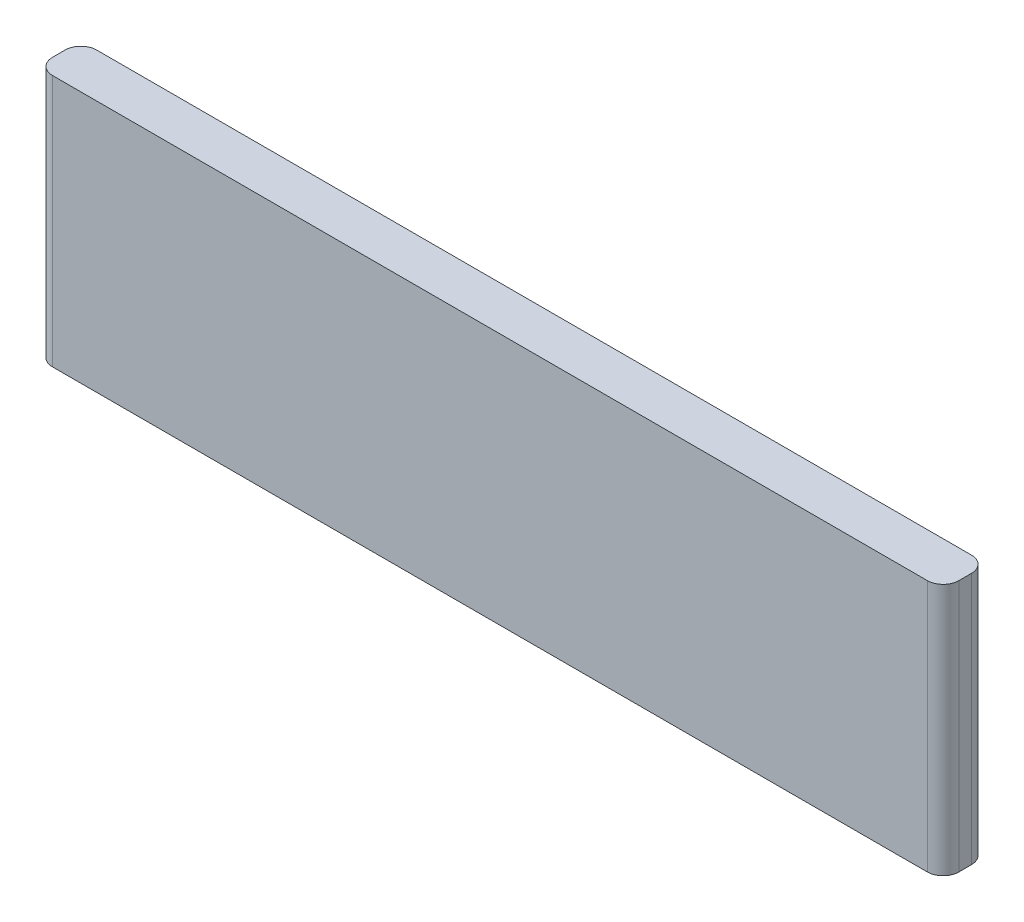
ISO-10303-21;
HEADER;
FILE_DESCRIPTION(('STEP AP214'),'2;1');
FILE_NAME('part.step','',(''),(''),'','','');
FILE_SCHEMA(('AUTOMOTIVE_DESIGN { 1 0 10303 214 1 1 1 1 }'));
ENDSEC;
DATA;
#1=APPLICATION_CONTEXT('core data for automotive mechanical design processes');
#2=APPLICATION_PROTOCOL_DEFINITION('international standard','automotive_design',2000,#1);
#3=PRODUCT_CONTEXT('',#1,'mechanical');
#4=PRODUCT('Part','Part','',(#3));
#5=PRODUCT_RELATED_PRODUCT_CATEGORY('part','',(#4));
#6=PRODUCT_DEFINITION_FORMATION('','',#4);
#7=PRODUCT_DEFINITION_CONTEXT('part definition',#1,'design');
#8=PRODUCT_DEFINITION('design','',#6,#7);
#9=PRODUCT_DEFINITION_SHAPE('','',#8);
#10=(LENGTH_UNIT() NAMED_UNIT(*) SI_UNIT(.MILLI.,.METRE.));
#11=(NAMED_UNIT(*) PLANE_ANGLE_UNIT() SI_UNIT($,.RADIAN.));
#12=(NAMED_UNIT(*) SI_UNIT($,.STERADIAN.) SOLID_ANGLE_UNIT());
#13=UNCERTAINTY_MEASURE_WITH_UNIT(LENGTH_MEASURE(1.E-05),#10,'distance_accuracy_value','');
#14=(GEOMETRIC_REPRESENTATION_CONTEXT(3) GLOBAL_UNCERTAINTY_ASSIGNED_CONTEXT((#13)) GLOBAL_UNIT_ASSIGNED_CONTEXT((#10,
#11,#12)) REPRESENTATION_CONTEXT('',''));
#15=CARTESIAN_POINT('',(0.,0.,0.));
#16=DIRECTION('',(0.,0.,1.));
#17=DIRECTION('',(1.,0.,0.));
#18=AXIS2_PLACEMENT_3D('',#15,#16,#17);
#19=CARTESIAN_POINT('',(21.55,12.,1.05));
#20=DIRECTION('',(-1.,0.,0.));
#21=DIRECTION('',(0.,0.,1.));
#22=AXIS2_PLACEMENT_3D('',#19,#20,#21);
#23=PLANE('',#22);
#24=DIRECTION('',(0.,0.,-1.));
#25=VECTOR('',#24,1.);
#26=CARTESIAN_POINT('',(21.55,0.,1.05));
#27=LINE('',#26,#25);
#28=CARTESIAN_POINT('',(21.55,0.,0.3));
#29=VERTEX_POINT('',#28);
#30=CARTESIAN_POINT('',(21.55,0.,-0.3));
#31=VERTEX_POINT('',#30);
#32=EDGE_CURVE('E188',#29,#31,#27,.T.);
#33=ORIENTED_EDGE('',*,*,#32,.T.);
#34=DIRECTION('',(0.,-1.,0.));
#35=VECTOR('',#34,1.);
#36=CARTESIAN_POINT('',(21.55,12.,-0.3));
#37=LINE('',#36,#35);
#38=CARTESIAN_POINT('',(21.55,12.,-0.3));
#39=VERTEX_POINT('',#38);
#40=EDGE_CURVE('E11',#31,#39,#37,.F.);
#41=ORIENTED_EDGE('',*,*,#40,.T.);
#42=DIRECTION('',(0.,0.,-1.));
#43=VECTOR('',#42,1.);
#44=CARTESIAN_POINT('',(21.55,12.,1.05));
#45=LINE('',#44,#43);
#46=CARTESIAN_POINT('',(21.55,12.,0.3));
#47=VERTEX_POINT('',#46);
#48=EDGE_CURVE('E141',#47,#39,#45,.T.);
#49=ORIENTED_EDGE('',*,*,#48,.F.);
#50=DIRECTION('',(0.,-1.,0.));
#51=VECTOR('',#50,1.);
#52=CARTESIAN_POINT('',(21.55,12.,0.3));
#53=LINE('',#52,#51);
#54=EDGE_CURVE('E54',#47,#29,#53,.T.);
#55=ORIENTED_EDGE('',*,*,#54,.T.);
#56=EDGE_LOOP('',(#33,#41,#49,#55));
#57=FACE_BOUND('',#56,.T.);
#58=ADVANCED_FACE('F45',(#57),#23,.F.);
#59=CARTESIAN_POINT('',(-21.55,12.,-1.05));
#60=DIRECTION('',(0.,0.,1.));
#61=DIRECTION('',(1.,0.,0.));
#62=AXIS2_PLACEMENT_3D('',#59,#60,#61);
#63=PLANE('',#62);
#64=DIRECTION('',(-1.,0.,0.));
#65=VECTOR('',#64,1.);
#66=CARTESIAN_POINT('',(-21.55,0.,-1.05));
#67=LINE('',#66,#65);
#68=CARTESIAN_POINT('',(20.8,0.,-1.05));
#69=VERTEX_POINT('',#68);
#70=CARTESIAN_POINT('',(-20.8,0.,-1.05));
#71=VERTEX_POINT('',#70);
#72=EDGE_CURVE('E148',#69,#71,#67,.T.);
#73=ORIENTED_EDGE('',*,*,#72,.T.);
#74=DIRECTION('',(0.,-1.,0.));
#75=VECTOR('',#74,1.);
#76=CARTESIAN_POINT('',(-20.8,12.,-1.05));
#77=LINE('',#76,#75);
#78=CARTESIAN_POINT('',(-20.8,12.,-1.05));
#79=VERTEX_POINT('',#78);
#80=EDGE_CURVE('E61',#71,#79,#77,.F.);
#81=ORIENTED_EDGE('',*,*,#80,.T.);
#82=DIRECTION('',(-1.,0.,0.));
#83=VECTOR('',#82,1.);
#84=CARTESIAN_POINT('',(-21.55,12.,-1.05));
#85=LINE('',#84,#83);
#86=CARTESIAN_POINT('',(20.8,12.,-1.05));
#87=VERTEX_POINT('',#86);
#88=EDGE_CURVE('E146',#87,#79,#85,.T.);
#89=ORIENTED_EDGE('',*,*,#88,.F.);
#90=DIRECTION('',(0.,-1.,0.));
#91=VECTOR('',#90,1.);
#92=CARTESIAN_POINT('',(20.8,12.,-1.05));
#93=LINE('',#92,#91);
#94=EDGE_CURVE('E177',#87,#69,#93,.T.);
#95=ORIENTED_EDGE('',*,*,#94,.T.);
#96=EDGE_LOOP('',(#73,#81,#89,#95));
#97=FACE_BOUND('',#96,.T.);
#98=ADVANCED_FACE('F213',(#97),#63,.F.);
#99=CARTESIAN_POINT('',(-21.55,12.,1.05));
#100=DIRECTION('',(1.,0.,0.));
#101=DIRECTION('',(0.,0.,-1.));
#102=AXIS2_PLACEMENT_3D('',#99,#100,#101);
#103=PLANE('',#102);
#104=DIRECTION('',(0.,0.,1.));
#105=VECTOR('',#104,1.);
#106=CARTESIAN_POINT('',(-21.55,0.,1.05));
#107=LINE('',#106,#105);
#108=CARTESIAN_POINT('',(-21.55,0.,-0.3));
#109=VERTEX_POINT('',#108);
#110=CARTESIAN_POINT('',(-21.55,0.,0.3));
#111=VERTEX_POINT('',#110);
#112=EDGE_CURVE('E142',#109,#111,#107,.T.);
#113=ORIENTED_EDGE('',*,*,#112,.T.);
#114=DIRECTION('',(0.,-1.,0.));
#115=VECTOR('',#114,1.);
#116=CARTESIAN_POINT('',(-21.55,12.,0.3));
#117=LINE('',#116,#115);
#118=CARTESIAN_POINT('',(-21.55,12.,0.3));
#119=VERTEX_POINT('',#118);
#120=EDGE_CURVE('E117',#111,#119,#117,.F.);
#121=ORIENTED_EDGE('',*,*,#120,.T.);
#122=DIRECTION('',(0.,0.,1.));
#123=VECTOR('',#122,1.);
#124=CARTESIAN_POINT('',(-21.55,12.,1.05));
#125=LINE('',#124,#123);
#126=CARTESIAN_POINT('',(-21.55,12.,-0.3));
#127=VERTEX_POINT('',#126);
#128=EDGE_CURVE('E199',#127,#119,#125,.T.);
#129=ORIENTED_EDGE('',*,*,#128,.F.);
#130=DIRECTION('',(0.,-1.,0.));
#131=VECTOR('',#130,1.);
#132=CARTESIAN_POINT('',(-21.55,12.,-0.3));
#133=LINE('',#132,#131);
#134=EDGE_CURVE('E123',#127,#109,#133,.T.);
#135=ORIENTED_EDGE('',*,*,#134,.T.);
#136=EDGE_LOOP('',(#113,#121,#129,#135));
#137=FACE_BOUND('',#136,.T.);
#138=ADVANCED_FACE('F212',(#137),#103,.F.);
#139=CARTESIAN_POINT('',(-21.55,12.,1.05));
#140=DIRECTION('',(0.,0.,-1.));
#141=DIRECTION('',(-1.,0.,0.));
#142=AXIS2_PLACEMENT_3D('',#139,#140,#141);
#143=PLANE('',#142);
#144=DIRECTION('',(1.,0.,0.));
#145=VECTOR('',#144,1.);
#146=CARTESIAN_POINT('',(-21.55,12.,1.05));
#147=LINE('',#146,#145);
#148=CARTESIAN_POINT('',(-20.8,12.,1.05));
#149=VERTEX_POINT('',#148);
#150=CARTESIAN_POINT('',(20.8,12.,1.05));
#151=VERTEX_POINT('',#150);
#152=EDGE_CURVE('E133',#149,#151,#147,.T.);
#153=ORIENTED_EDGE('',*,*,#152,.F.);
#154=DIRECTION('',(0.,-1.,0.));
#155=VECTOR('',#154,1.);
#156=CARTESIAN_POINT('',(-20.8,12.,1.05));
#157=LINE('',#156,#155);
#158=CARTESIAN_POINT('',(-20.8,0.,1.05));
#159=VERTEX_POINT('',#158);
#160=EDGE_CURVE('E116',#149,#159,#157,.T.);
#161=ORIENTED_EDGE('',*,*,#160,.T.);
#162=DIRECTION('',(1.,0.,0.));
#163=VECTOR('',#162,1.);
#164=CARTESIAN_POINT('',(-21.55,0.,1.05));
#165=LINE('',#164,#163);
#166=CARTESIAN_POINT('',(20.8,0.,1.05));
#167=VERTEX_POINT('',#166);
#168=EDGE_CURVE('E130',#159,#167,#165,.T.);
#169=ORIENTED_EDGE('',*,*,#168,.T.);
#170=DIRECTION('',(0.,-1.,0.));
#171=VECTOR('',#170,1.);
#172=CARTESIAN_POINT('',(20.8,12.,1.05));
#173=LINE('',#172,#171);
#174=EDGE_CURVE('E136',#167,#151,#173,.F.);
#175=ORIENTED_EDGE('',*,*,#174,.T.);
#176=EDGE_LOOP('',(#153,#161,#169,#175));
#177=FACE_BOUND('',#176,.T.);
#178=ADVANCED_FACE('F129',(#177),#143,.F.);
#179=CARTESIAN_POINT('',(0.,12.,0.));
#180=DIRECTION('',(0.,-1.,0.));
#181=DIRECTION('',(0.,0.,-1.));
#182=AXIS2_PLACEMENT_3D('',#179,#180,#181);
#183=PLANE('',#182);
#184=ORIENTED_EDGE('',*,*,#128,.T.);
#185=CARTESIAN_POINT('',(-20.8,12.,0.3));
#186=DIRECTION('',(0.,-1.,0.));
#187=DIRECTION('',(0.,0.,-1.));
#188=AXIS2_PLACEMENT_3D('',#185,#186,#187);
#189=CIRCLE('',#188,0.75);
#190=EDGE_CURVE('E174',#119,#149,#189,.F.);
#191=ORIENTED_EDGE('',*,*,#190,.T.);
#192=ORIENTED_EDGE('',*,*,#152,.T.);
#193=CARTESIAN_POINT('',(20.8,12.,0.3));
#194=DIRECTION('',(0.,-1.,0.));
#195=DIRECTION('',(0.,0.,-1.));
#196=AXIS2_PLACEMENT_3D('',#193,#194,#195);
#197=CIRCLE('',#196,0.75);
#198=EDGE_CURVE('E166',#151,#47,#197,.F.);
#199=ORIENTED_EDGE('',*,*,#198,.T.);
#200=ORIENTED_EDGE('',*,*,#48,.T.);
#201=CARTESIAN_POINT('',(20.8,12.,-0.3));
#202=DIRECTION('',(0.,-1.,0.));
#203=DIRECTION('',(0.,0.,-1.));
#204=AXIS2_PLACEMENT_3D('',#201,#202,#203);
#205=CIRCLE('',#204,0.75);
#206=EDGE_CURVE('E68',#39,#87,#205,.F.);
#207=ORIENTED_EDGE('',*,*,#206,.T.);
#208=ORIENTED_EDGE('',*,*,#88,.T.);
#209=CARTESIAN_POINT('',(-20.8,12.,-0.3));
#210=DIRECTION('',(0.,-1.,0.));
#211=DIRECTION('',(0.,0.,-1.));
#212=AXIS2_PLACEMENT_3D('',#209,#210,#211);
#213=CIRCLE('',#212,0.75);
#214=EDGE_CURVE('E171',#79,#127,#213,.F.);
#215=ORIENTED_EDGE('',*,*,#214,.T.);
#216=EDGE_LOOP('',(#184,#191,#192,#199,#200,#207,#208,#215));
#217=FACE_BOUND('',#216,.T.);
#218=ADVANCED_FACE('F205',(#217),#183,.F.);
#219=CARTESIAN_POINT('',(0.,0.,0.));
#220=DIRECTION('',(0.,-1.,0.));
#221=DIRECTION('',(0.,0.,-1.));
#222=AXIS2_PLACEMENT_3D('',#219,#220,#221);
#223=PLANE('',#222);
#224=ORIENTED_EDGE('',*,*,#168,.F.);
#225=CARTESIAN_POINT('',(-20.8,0.,0.3));
#226=DIRECTION('',(0.,-1.,0.));
#227=DIRECTION('',(0.,0.,-1.));
#228=AXIS2_PLACEMENT_3D('',#225,#226,#227);
#229=CIRCLE('',#228,0.75);
#230=EDGE_CURVE('E112',#159,#111,#229,.T.);
#231=ORIENTED_EDGE('',*,*,#230,.T.);
#232=ORIENTED_EDGE('',*,*,#112,.F.);
#233=CARTESIAN_POINT('',(-20.8,0.,-0.3));
#234=DIRECTION('',(0.,-1.,0.));
#235=DIRECTION('',(0.,0.,-1.));
#236=AXIS2_PLACEMENT_3D('',#233,#234,#235);
#237=CIRCLE('',#236,0.75);
#238=EDGE_CURVE('E124',#109,#71,#237,.T.);
#239=ORIENTED_EDGE('',*,*,#238,.T.);
#240=ORIENTED_EDGE('',*,*,#72,.F.);
#241=CARTESIAN_POINT('',(20.8,0.,-0.3));
#242=DIRECTION('',(0.,-1.,0.));
#243=DIRECTION('',(0.,0.,-1.));
#244=AXIS2_PLACEMENT_3D('',#241,#242,#243);
#245=CIRCLE('',#244,0.75);
#246=EDGE_CURVE('E156',#69,#31,#245,.T.);
#247=ORIENTED_EDGE('',*,*,#246,.T.);
#248=ORIENTED_EDGE('',*,*,#32,.F.);
#249=CARTESIAN_POINT('',(20.8,0.,0.3));
#250=DIRECTION('',(0.,-1.,0.));
#251=DIRECTION('',(0.,0.,-1.));
#252=AXIS2_PLACEMENT_3D('',#249,#250,#251);
#253=CIRCLE('',#252,0.75);
#254=EDGE_CURVE('E135',#29,#167,#253,.T.);
#255=ORIENTED_EDGE('',*,*,#254,.T.);
#256=EDGE_LOOP('',(#224,#231,#232,#239,#240,#247,#248,#255));
#257=FACE_BOUND('',#256,.T.);
#258=ADVANCED_FACE('F138',(#257),#223,.T.);
#259=CARTESIAN_POINT('',(-20.8,12.,0.3));
#260=DIRECTION('',(0.,-1.,0.));
#261=DIRECTION('',(0.,0.,-1.));
#262=AXIS2_PLACEMENT_3D('',#259,#260,#261);
#263=CYLINDRICAL_SURFACE('',#262,0.75);
#264=ORIENTED_EDGE('',*,*,#190,.F.);
#265=ORIENTED_EDGE('',*,*,#120,.F.);
#266=ORIENTED_EDGE('',*,*,#230,.F.);
#267=ORIENTED_EDGE('',*,*,#160,.F.);
#268=EDGE_LOOP('',(#264,#265,#266,#267));
#269=FACE_BOUND('',#268,.T.);
#270=ADVANCED_FACE('F115',(#269),#263,.T.);
#271=CARTESIAN_POINT('',(-20.8,12.,-0.3));
#272=DIRECTION('',(0.,-1.,0.));
#273=DIRECTION('',(0.,0.,-1.));
#274=AXIS2_PLACEMENT_3D('',#271,#272,#273);
#275=CYLINDRICAL_SURFACE('',#274,0.75);
#276=ORIENTED_EDGE('',*,*,#214,.F.);
#277=ORIENTED_EDGE('',*,*,#80,.F.);
#278=ORIENTED_EDGE('',*,*,#238,.F.);
#279=ORIENTED_EDGE('',*,*,#134,.F.);
#280=EDGE_LOOP('',(#276,#277,#278,#279));
#281=FACE_BOUND('',#280,.T.);
#282=ADVANCED_FACE('F210',(#281),#275,.T.);
#283=CARTESIAN_POINT('',(20.8,12.,-0.3));
#284=DIRECTION('',(0.,-1.,0.));
#285=DIRECTION('',(0.,0.,-1.));
#286=AXIS2_PLACEMENT_3D('',#283,#284,#285);
#287=CYLINDRICAL_SURFACE('',#286,0.75);
#288=ORIENTED_EDGE('',*,*,#206,.F.);
#289=ORIENTED_EDGE('',*,*,#40,.F.);
#290=ORIENTED_EDGE('',*,*,#246,.F.);
#291=ORIENTED_EDGE('',*,*,#94,.F.);
#292=EDGE_LOOP('',(#288,#289,#290,#291));
#293=FACE_BOUND('',#292,.T.);
#294=ADVANCED_FACE('F215',(#293),#287,.T.);
#295=CARTESIAN_POINT('',(20.8,12.,0.3));
#296=DIRECTION('',(0.,-1.,0.));
#297=DIRECTION('',(0.,0.,-1.));
#298=AXIS2_PLACEMENT_3D('',#295,#296,#297);
#299=CYLINDRICAL_SURFACE('',#298,0.75);
#300=ORIENTED_EDGE('',*,*,#198,.F.);
#301=ORIENTED_EDGE('',*,*,#174,.F.);
#302=ORIENTED_EDGE('',*,*,#254,.F.);
#303=ORIENTED_EDGE('',*,*,#54,.F.);
#304=EDGE_LOOP('',(#300,#301,#302,#303));
#305=FACE_BOUND('',#304,.T.);
#306=ADVANCED_FACE('F47',(#305),#299,.T.);
#307=CLOSED_SHELL('',(#58,#98,#138,#178,#218,#258,#270,#282,#294,#306));
#308=MANIFOLD_SOLID_BREP('B2',#307);
#309=ADVANCED_BREP_SHAPE_REPRESENTATION('',(#18,#308),#14);
#310=SHAPE_DEFINITION_REPRESENTATION(#9,#309);
ENDSEC;
END-ISO-10303-21;
